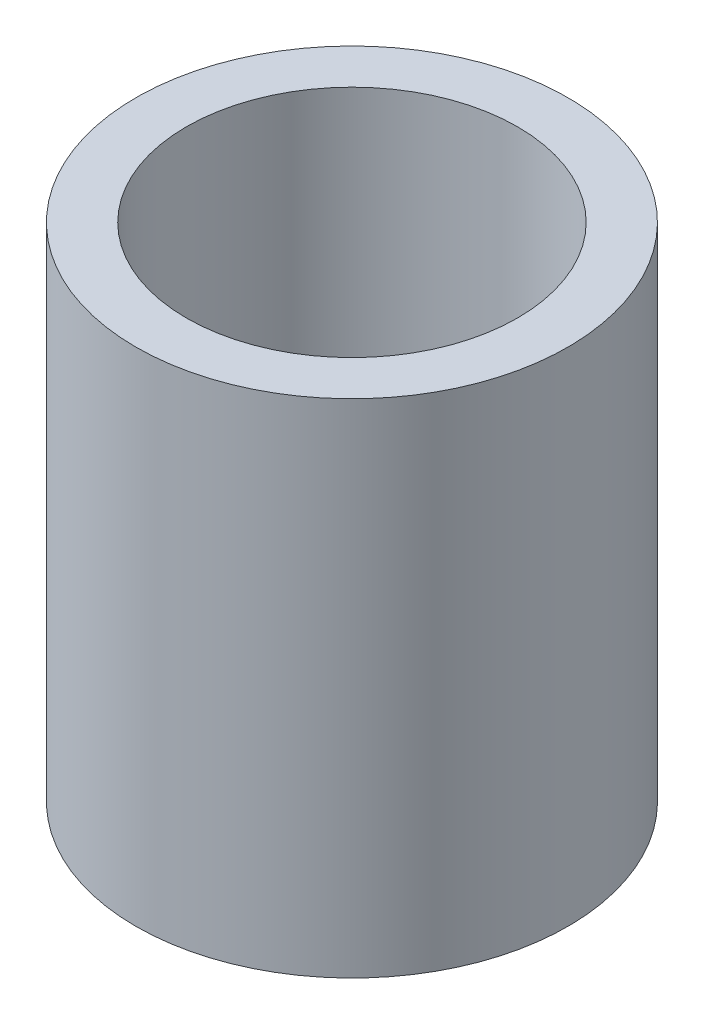
ISO-10303-21;
HEADER;
FILE_DESCRIPTION(('STEP AP214'),'2;1');
FILE_NAME('part.step','',(''),(''),'','','');
FILE_SCHEMA(('AUTOMOTIVE_DESIGN { 1 0 10303 214 1 1 1 1 }'));
ENDSEC;
DATA;
#1=APPLICATION_CONTEXT('core data for automotive mechanical design processes');
#2=APPLICATION_PROTOCOL_DEFINITION('international standard','automotive_design',2000,#1);
#3=PRODUCT_CONTEXT('',#1,'mechanical');
#4=PRODUCT('Part','Part','',(#3));
#5=PRODUCT_RELATED_PRODUCT_CATEGORY('part','',(#4));
#6=PRODUCT_DEFINITION_FORMATION('','',#4);
#7=PRODUCT_DEFINITION_CONTEXT('part definition',#1,'design');
#8=PRODUCT_DEFINITION('design','',#6,#7);
#9=PRODUCT_DEFINITION_SHAPE('','',#8);
#10=(LENGTH_UNIT() NAMED_UNIT(*) SI_UNIT(.MILLI.,.METRE.));
#11=(NAMED_UNIT(*) PLANE_ANGLE_UNIT() SI_UNIT($,.RADIAN.));
#12=(NAMED_UNIT(*) SI_UNIT($,.STERADIAN.) SOLID_ANGLE_UNIT());
#13=UNCERTAINTY_MEASURE_WITH_UNIT(LENGTH_MEASURE(1.E-05),#10,'distance_accuracy_value','');
#14=(GEOMETRIC_REPRESENTATION_CONTEXT(3) GLOBAL_UNCERTAINTY_ASSIGNED_CONTEXT((#13)) GLOBAL_UNIT_ASSIGNED_CONTEXT((#10,
#11,#12)) REPRESENTATION_CONTEXT('',''));
#15=CARTESIAN_POINT('',(0.,0.,0.));
#16=DIRECTION('',(0.,0.,1.));
#17=DIRECTION('',(1.,0.,0.));
#18=AXIS2_PLACEMENT_3D('',#15,#16,#17);
#19=CARTESIAN_POINT('',(0.,20.9,0.));
#20=DIRECTION('',(0.,1.,0.));
#21=DIRECTION('',(0.,0.,1.));
#22=AXIS2_PLACEMENT_3D('',#19,#20,#21);
#23=PLANE('',#22);
#24=CARTESIAN_POINT('',(0.,20.9,0.));
#25=DIRECTION('',(0.,1.,0.));
#26=DIRECTION('',(0.,0.,1.));
#27=AXIS2_PLACEMENT_3D('',#24,#25,#26);
#28=CIRCLE('',#27,9.);
#29=CARTESIAN_POINT('',(0.,20.9,9.));
#30=VERTEX_POINT('',#29);
#31=EDGE_CURVE('E10',#30,#30,#28,.T.);
#32=ORIENTED_EDGE('',*,*,#31,.T.);
#33=EDGE_LOOP('',(#32));
#34=FACE_BOUND('',#33,.T.);
#35=CARTESIAN_POINT('',(0.,20.9,0.));
#36=DIRECTION('',(0.,1.,0.));
#37=DIRECTION('',(0.,0.,1.));
#38=AXIS2_PLACEMENT_3D('',#35,#36,#37);
#39=CIRCLE('',#38,6.9);
#40=CARTESIAN_POINT('',(0.,20.9,6.9));
#41=VERTEX_POINT('',#40);
#42=EDGE_CURVE('E42',#41,#41,#39,.T.);
#43=ORIENTED_EDGE('',*,*,#42,.F.);
#44=EDGE_LOOP('',(#43));
#45=FACE_BOUND('',#44,.T.);
#46=ADVANCED_FACE('F31',(#34,#45),#23,.T.);
#47=CARTESIAN_POINT('',(0.,0.,0.));
#48=DIRECTION('',(0.,1.,0.));
#49=DIRECTION('',(0.,0.,1.));
#50=AXIS2_PLACEMENT_3D('',#47,#48,#49);
#51=PLANE('',#50);
#52=CARTESIAN_POINT('',(0.,0.,0.));
#53=DIRECTION('',(0.,1.,0.));
#54=DIRECTION('',(0.,0.,1.));
#55=AXIS2_PLACEMENT_3D('',#52,#53,#54);
#56=CIRCLE('',#55,9.);
#57=CARTESIAN_POINT('',(0.,0.,9.));
#58=VERTEX_POINT('',#57);
#59=EDGE_CURVE('E35',#58,#58,#56,.T.);
#60=ORIENTED_EDGE('',*,*,#59,.F.);
#61=EDGE_LOOP('',(#60));
#62=FACE_BOUND('',#61,.T.);
#63=CARTESIAN_POINT('',(0.,0.,0.));
#64=DIRECTION('',(0.,1.,0.));
#65=DIRECTION('',(0.,0.,1.));
#66=AXIS2_PLACEMENT_3D('',#63,#64,#65);
#67=CIRCLE('',#66,6.9);
#68=CARTESIAN_POINT('',(0.,0.,6.9));
#69=VERTEX_POINT('',#68);
#70=EDGE_CURVE('E44',#69,#69,#67,.T.);
#71=ORIENTED_EDGE('',*,*,#70,.T.);
#72=EDGE_LOOP('',(#71));
#73=FACE_BOUND('',#72,.T.);
#74=ADVANCED_FACE('F54',(#62,#73),#51,.F.);
#75=CARTESIAN_POINT('',(0.,20.9,0.));
#76=DIRECTION('',(0.,-1.,0.));
#77=DIRECTION('',(0.,0.,-1.));
#78=AXIS2_PLACEMENT_3D('',#75,#76,#77);
#79=CYLINDRICAL_SURFACE('',#78,9.);
#80=ORIENTED_EDGE('',*,*,#31,.F.);
#81=EDGE_LOOP('',(#80));
#82=FACE_BOUND('',#81,.T.);
#83=ORIENTED_EDGE('',*,*,#59,.T.);
#84=EDGE_LOOP('',(#83));
#85=FACE_BOUND('',#84,.T.);
#86=ADVANCED_FACE('F33',(#82,#85),#79,.T.);
#87=CARTESIAN_POINT('',(0.,20.9,0.));
#88=DIRECTION('',(0.,-1.,0.));
#89=DIRECTION('',(0.,0.,-1.));
#90=AXIS2_PLACEMENT_3D('',#87,#88,#89);
#91=CYLINDRICAL_SURFACE('',#90,6.9);
#92=ORIENTED_EDGE('',*,*,#42,.T.);
#93=EDGE_LOOP('',(#92));
#94=FACE_BOUND('',#93,.T.);
#95=ORIENTED_EDGE('',*,*,#70,.F.);
#96=EDGE_LOOP('',(#95));
#97=FACE_BOUND('',#96,.T.);
#98=ADVANCED_FACE('F50',(#94,#97),#91,.F.);
#99=CLOSED_SHELL('',(#46,#74,#86,#98));
#100=MANIFOLD_SOLID_BREP('B2',#99);
#101=ADVANCED_BREP_SHAPE_REPRESENTATION('',(#18,#100),#14);
#102=SHAPE_DEFINITION_REPRESENTATION(#9,#101);
ENDSEC;
END-ISO-10303-21;
